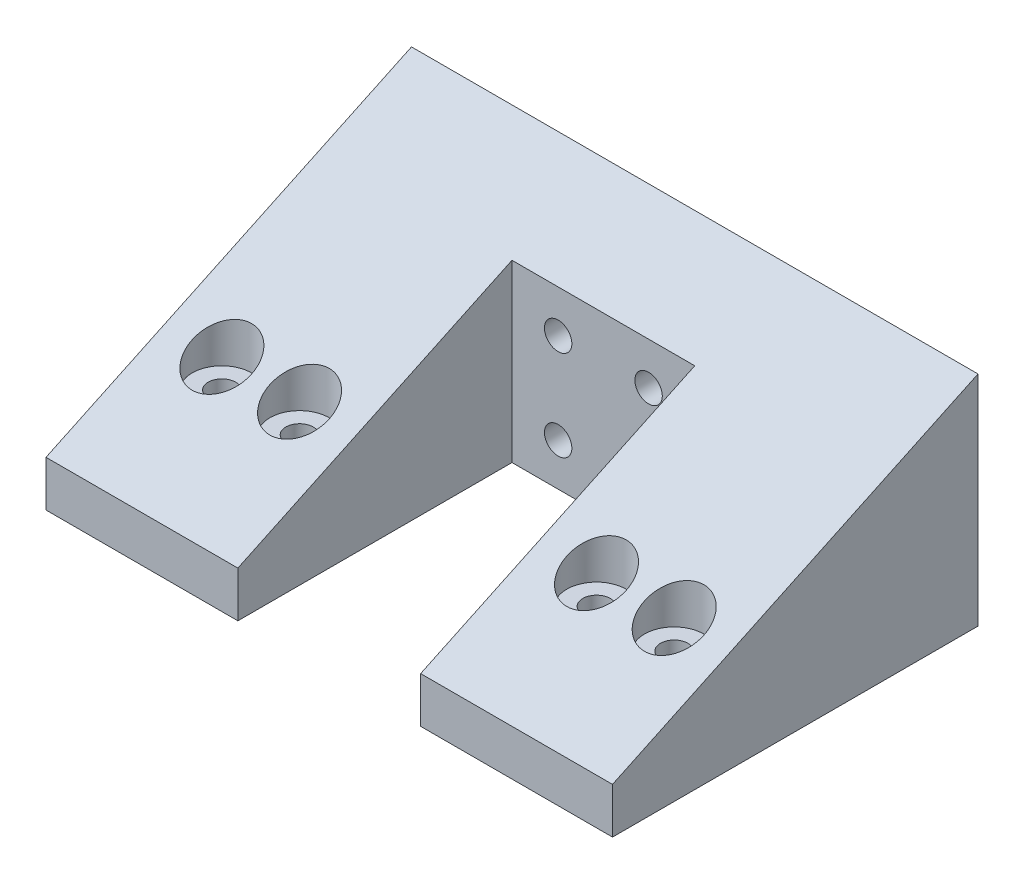
ISO-10303-21;
HEADER;
FILE_DESCRIPTION(('STEP AP214'),'2;1');
FILE_NAME('part.step','',(''),(''),'','','');
FILE_SCHEMA(('AUTOMOTIVE_DESIGN { 1 0 10303 214 1 1 1 1 }'));
ENDSEC;
DATA;
#1=APPLICATION_CONTEXT('core data for automotive mechanical design processes');
#2=APPLICATION_PROTOCOL_DEFINITION('international standard','automotive_design',2000,#1);
#3=PRODUCT_CONTEXT('',#1,'mechanical');
#4=PRODUCT('Part','Part','',(#3));
#5=PRODUCT_RELATED_PRODUCT_CATEGORY('part','',(#4));
#6=PRODUCT_DEFINITION_FORMATION('','',#4);
#7=PRODUCT_DEFINITION_CONTEXT('part definition',#1,'design');
#8=PRODUCT_DEFINITION('design','',#6,#7);
#9=PRODUCT_DEFINITION_SHAPE('','',#8);
#10=(LENGTH_UNIT() NAMED_UNIT(*) SI_UNIT(.MILLI.,.METRE.));
#11=(NAMED_UNIT(*) PLANE_ANGLE_UNIT() SI_UNIT($,.RADIAN.));
#12=(NAMED_UNIT(*) SI_UNIT($,.STERADIAN.) SOLID_ANGLE_UNIT());
#13=UNCERTAINTY_MEASURE_WITH_UNIT(LENGTH_MEASURE(1.E-05),#10,'distance_accuracy_value','');
#14=(GEOMETRIC_REPRESENTATION_CONTEXT(3) GLOBAL_UNCERTAINTY_ASSIGNED_CONTEXT((#13)) GLOBAL_UNIT_ASSIGNED_CONTEXT((#10,
#11,#12)) REPRESENTATION_CONTEXT('',''));
#15=CARTESIAN_POINT('',(0.,0.,0.));
#16=DIRECTION('',(0.,0.,1.));
#17=DIRECTION('',(1.,0.,0.));
#18=AXIS2_PLACEMENT_3D('',#15,#16,#17);
#19=CARTESIAN_POINT('',(0.,0.,40.));
#20=DIRECTION('',(0.,0.,-1.));
#21=DIRECTION('',(-1.,0.,0.));
#22=AXIS2_PLACEMENT_3D('',#19,#20,#21);
#23=PLANE('',#22);
#24=DIRECTION('',(0.,1.,0.));
#25=VECTOR('',#24,1.);
#26=CARTESIAN_POINT('',(31.,-11.95,40.));
#27=LINE('',#26,#25);
#28=CARTESIAN_POINT('',(31.,-11.95,40.));
#29=VERTEX_POINT('',#28);
#30=CARTESIAN_POINT('',(31.,-6.95,40.));
#31=VERTEX_POINT('',#30);
#32=EDGE_CURVE('E95',#29,#31,#27,.T.);
#33=ORIENTED_EDGE('',*,*,#32,.T.);
#34=DIRECTION('',(1.,0.,0.));
#35=VECTOR('',#34,1.);
#36=CARTESIAN_POINT('',(-31.,-6.95,40.));
#37=LINE('',#36,#35);
#38=CARTESIAN_POINT('',(9.99999999999999,-6.95,40.));
#39=VERTEX_POINT('',#38);
#40=EDGE_CURVE('E177',#39,#31,#37,.T.);
#41=ORIENTED_EDGE('',*,*,#40,.F.);
#42=DIRECTION('',(0.,1.,0.));
#43=VECTOR('',#42,1.);
#44=CARTESIAN_POINT('',(9.99999999999999,11.95,40.));
#45=LINE('',#44,#43);
#46=CARTESIAN_POINT('',(10.,-11.95,40.));
#47=VERTEX_POINT('',#46);
#48=EDGE_CURVE('E188',#47,#39,#45,.T.);
#49=ORIENTED_EDGE('',*,*,#48,.F.);
#50=DIRECTION('',(1.,0.,0.));
#51=VECTOR('',#50,1.);
#52=CARTESIAN_POINT('',(-31.,-11.95,40.));
#53=LINE('',#52,#51);
#54=EDGE_CURVE('E62',#47,#29,#53,.T.);
#55=ORIENTED_EDGE('',*,*,#54,.T.);
#56=EDGE_LOOP('',(#33,#41,#49,#55));
#57=FACE_BOUND('',#56,.T.);
#58=ADVANCED_FACE('F37',(#57),#23,.F.);
#59=CARTESIAN_POINT('',(-31.,-11.95,40.));
#60=DIRECTION('',(1.,0.,0.));
#61=DIRECTION('',(0.,0.,-1.));
#62=AXIS2_PLACEMENT_3D('',#59,#60,#61);
#63=PLANE('',#62);
#64=DIRECTION('',(0.,-1.,0.));
#65=VECTOR('',#64,1.);
#66=CARTESIAN_POINT('',(-31.,-11.95,40.));
#67=LINE('',#66,#65);
#68=CARTESIAN_POINT('',(-31.,-6.95,40.));
#69=VERTEX_POINT('',#68);
#70=CARTESIAN_POINT('',(-31.,-11.95,40.));
#71=VERTEX_POINT('',#70);
#72=EDGE_CURVE('E101',#69,#71,#67,.T.);
#73=ORIENTED_EDGE('',*,*,#72,.F.);
#74=DIRECTION('',(0.,0.427211653760932,-0.904151648171284));
#75=VECTOR('',#74,1.);
#76=CARTESIAN_POINT('',(-31.,11.95,0.));
#77=LINE('',#76,#75);
#78=CARTESIAN_POINT('',(-31.,11.95,0.));
#79=VERTEX_POINT('',#78);
#80=EDGE_CURVE('E174',#69,#79,#77,.T.);
#81=ORIENTED_EDGE('',*,*,#80,.T.);
#82=DIRECTION('',(0.,-1.,0.));
#83=VECTOR('',#82,1.);
#84=CARTESIAN_POINT('',(-31.,-11.95,0.));
#85=LINE('',#84,#83);
#86=CARTESIAN_POINT('',(-31.,-11.95,0.));
#87=VERTEX_POINT('',#86);
#88=EDGE_CURVE('E87',#79,#87,#85,.T.);
#89=ORIENTED_EDGE('',*,*,#88,.T.);
#90=DIRECTION('',(0.,0.,-1.));
#91=VECTOR('',#90,1.);
#92=CARTESIAN_POINT('',(-31.,-11.95,40.));
#93=LINE('',#92,#91);
#94=EDGE_CURVE('E46',#71,#87,#93,.T.);
#95=ORIENTED_EDGE('',*,*,#94,.F.);
#96=EDGE_LOOP('',(#73,#81,#89,#95));
#97=FACE_BOUND('',#96,.T.);
#98=ADVANCED_FACE('F39',(#97),#63,.F.);
#99=CARTESIAN_POINT('',(-31.,-11.95,40.));
#100=DIRECTION('',(0.,1.,0.));
#101=DIRECTION('',(0.,0.,1.));
#102=AXIS2_PLACEMENT_3D('',#99,#100,#101);
#103=PLANE('',#102);
#104=CARTESIAN_POINT('',(-24.75,-11.95,27.));
#105=DIRECTION('',(0.,1.,0.));
#106=DIRECTION('',(0.,0.,1.));
#107=AXIS2_PLACEMENT_3D('',#104,#105,#106);
#108=CIRCLE('',#107,1.5);
#109=CARTESIAN_POINT('',(-24.75,-11.95,28.5));
#110=VERTEX_POINT('',#109);
#111=EDGE_CURVE('E124',#110,#110,#108,.T.);
#112=ORIENTED_EDGE('',*,*,#111,.T.);
#113=EDGE_LOOP('',(#112));
#114=FACE_BOUND('',#113,.T.);
#115=CARTESIAN_POINT('',(-16.25,-11.95,26.9999999999999));
#116=DIRECTION('',(0.,1.,0.));
#117=DIRECTION('',(0.,0.,1.));
#118=AXIS2_PLACEMENT_3D('',#115,#116,#117);
#119=CIRCLE('',#118,1.5);
#120=CARTESIAN_POINT('',(-16.25,-11.95,28.4999999999999));
#121=VERTEX_POINT('',#120);
#122=EDGE_CURVE('E278',#121,#121,#119,.T.);
#123=ORIENTED_EDGE('',*,*,#122,.T.);
#124=EDGE_LOOP('',(#123));
#125=FACE_BOUND('',#124,.T.);
#126=CARTESIAN_POINT('',(16.25,-11.95,26.9999999999999));
#127=DIRECTION('',(0.,1.,0.));
#128=DIRECTION('',(0.,0.,-1.));
#129=AXIS2_PLACEMENT_3D('',#126,#127,#128);
#130=CIRCLE('',#129,1.5);
#131=CARTESIAN_POINT('',(16.25,-11.95,28.4999999999999));
#132=VERTEX_POINT('',#131);
#133=EDGE_CURVE('E282',#132,#132,#130,.T.);
#134=ORIENTED_EDGE('',*,*,#133,.T.);
#135=EDGE_LOOP('',(#134));
#136=FACE_BOUND('',#135,.T.);
#137=CARTESIAN_POINT('',(24.75,-11.95,27.));
#138=DIRECTION('',(0.,1.,0.));
#139=DIRECTION('',(0.,0.,-1.));
#140=AXIS2_PLACEMENT_3D('',#137,#138,#139);
#141=CIRCLE('',#140,1.50000000000001);
#142=CARTESIAN_POINT('',(24.75,-11.95,28.5));
#143=VERTEX_POINT('',#142);
#144=EDGE_CURVE('E144',#143,#143,#141,.T.);
#145=ORIENTED_EDGE('',*,*,#144,.T.);
#146=EDGE_LOOP('',(#145));
#147=FACE_BOUND('',#146,.T.);
#148=ORIENTED_EDGE('',*,*,#54,.F.);
#149=DIRECTION('',(0.,0.,1.));
#150=VECTOR('',#149,1.);
#151=CARTESIAN_POINT('',(10.,-11.95,-31.1642423299525));
#152=LINE('',#151,#150);
#153=CARTESIAN_POINT('',(10.,-11.95,10.));
#154=VERTEX_POINT('',#153);
#155=EDGE_CURVE('E196',#154,#47,#152,.T.);
#156=ORIENTED_EDGE('',*,*,#155,.F.);
#157=DIRECTION('',(1.,0.,0.));
#158=VECTOR('',#157,1.);
#159=CARTESIAN_POINT('',(-10.,-11.95,10.));
#160=LINE('',#159,#158);
#161=CARTESIAN_POINT('',(-10.,-11.95,10.));
#162=VERTEX_POINT('',#161);
#163=EDGE_CURVE('E191',#162,#154,#160,.T.);
#164=ORIENTED_EDGE('',*,*,#163,.F.);
#165=DIRECTION('',(0.,0.,1.));
#166=VECTOR('',#165,1.);
#167=CARTESIAN_POINT('',(-10.,-11.95,-31.1642423299525));
#168=LINE('',#167,#166);
#169=CARTESIAN_POINT('',(-10.,-11.95,40.));
#170=VERTEX_POINT('',#169);
#171=EDGE_CURVE('E200',#162,#170,#168,.T.);
#172=ORIENTED_EDGE('',*,*,#171,.T.);
#173=EDGE_CURVE('E209',#71,#170,#53,.T.);
#174=ORIENTED_EDGE('',*,*,#173,.F.);
#175=ORIENTED_EDGE('',*,*,#94,.T.);
#176=DIRECTION('',(1.,0.,0.));
#177=VECTOR('',#176,1.);
#178=CARTESIAN_POINT('',(-31.,-11.95,0.));
#179=LINE('',#178,#177);
#180=CARTESIAN_POINT('',(31.,-11.95,0.));
#181=VERTEX_POINT('',#180);
#182=EDGE_CURVE('E75',#87,#181,#179,.T.);
#183=ORIENTED_EDGE('',*,*,#182,.T.);
#184=DIRECTION('',(0.,0.,-1.));
#185=VECTOR('',#184,1.);
#186=CARTESIAN_POINT('',(31.,-11.95,40.));
#187=LINE('',#186,#185);
#188=EDGE_CURVE('E78',#29,#181,#187,.T.);
#189=ORIENTED_EDGE('',*,*,#188,.F.);
#190=EDGE_LOOP('',(#148,#156,#164,#172,#174,#175,#183,#189));
#191=FACE_BOUND('',#190,.T.);
#192=ADVANCED_FACE('F77',(#114,#125,#136,#147,#191),#103,.F.);
#193=CARTESIAN_POINT('',(31.,-11.95,40.));
#194=DIRECTION('',(-1.,0.,0.));
#195=DIRECTION('',(0.,0.,1.));
#196=AXIS2_PLACEMENT_3D('',#193,#194,#195);
#197=PLANE('',#196);
#198=DIRECTION('',(0.,1.,0.));
#199=VECTOR('',#198,1.);
#200=CARTESIAN_POINT('',(31.,-11.95,0.));
#201=LINE('',#200,#199);
#202=CARTESIAN_POINT('',(31.,11.95,0.));
#203=VERTEX_POINT('',#202);
#204=EDGE_CURVE('E86',#181,#203,#201,.T.);
#205=ORIENTED_EDGE('',*,*,#204,.T.);
#206=DIRECTION('',(0.,0.427211653760932,-0.904151648171284));
#207=VECTOR('',#206,1.);
#208=CARTESIAN_POINT('',(31.,11.95,0.));
#209=LINE('',#208,#207);
#210=EDGE_CURVE('E171',#31,#203,#209,.T.);
#211=ORIENTED_EDGE('',*,*,#210,.F.);
#212=ORIENTED_EDGE('',*,*,#32,.F.);
#213=ORIENTED_EDGE('',*,*,#188,.T.);
#214=EDGE_LOOP('',(#205,#211,#212,#213));
#215=FACE_BOUND('',#214,.T.);
#216=ADVANCED_FACE('F91',(#215),#197,.F.);
#217=DIRECTION('',(0.,-1.,0.));
#218=VECTOR('',#217,1.);
#219=CARTESIAN_POINT('',(-10.,11.95,40.));
#220=LINE('',#219,#218);
#221=CARTESIAN_POINT('',(-10.,-6.94999999999999,40.));
#222=VERTEX_POINT('',#221);
#223=EDGE_CURVE('E187',#222,#170,#220,.T.);
#224=ORIENTED_EDGE('',*,*,#223,.F.);
#225=EDGE_CURVE('E54',#69,#222,#37,.T.);
#226=ORIENTED_EDGE('',*,*,#225,.F.);
#227=ORIENTED_EDGE('',*,*,#72,.T.);
#228=ORIENTED_EDGE('',*,*,#173,.T.);
#229=EDGE_LOOP('',(#224,#226,#227,#228));
#230=FACE_BOUND('',#229,.T.);
#231=ADVANCED_FACE('F251',(#230),#23,.F.);
#232=CARTESIAN_POINT('',(0.,0.,0.));
#233=DIRECTION('',(0.,0.,-1.));
#234=DIRECTION('',(-1.,0.,0.));
#235=AXIS2_PLACEMENT_3D('',#232,#233,#234);
#236=PLANE('',#235);
#237=CARTESIAN_POINT('',(-4.95,-7.3125,0.));
#238=DIRECTION('',(0.,0.,1.));
#239=DIRECTION('',(1.,0.,0.));
#240=AXIS2_PLACEMENT_3D('',#237,#238,#239);
#241=CIRCLE('',#240,1.5);
#242=CARTESIAN_POINT('',(-3.45,-7.3125,0.));
#243=VERTEX_POINT('',#242);
#244=EDGE_CURVE('E163',#243,#243,#241,.T.);
#245=ORIENTED_EDGE('',*,*,#244,.T.);
#246=EDGE_LOOP('',(#245));
#247=FACE_BOUND('',#246,.T.);
#248=CARTESIAN_POINT('',(4.95,-7.3125,0.));
#249=DIRECTION('',(0.,0.,1.));
#250=DIRECTION('',(1.,0.,0.));
#251=AXIS2_PLACEMENT_3D('',#248,#249,#250);
#252=CIRCLE('',#251,1.5);
#253=CARTESIAN_POINT('',(6.45,-7.3125,0.));
#254=VERTEX_POINT('',#253);
#255=EDGE_CURVE('E157',#254,#254,#252,.T.);
#256=ORIENTED_EDGE('',*,*,#255,.T.);
#257=EDGE_LOOP('',(#256));
#258=FACE_BOUND('',#257,.T.);
#259=CARTESIAN_POINT('',(4.95,2.5875,0.));
#260=DIRECTION('',(0.,0.,1.));
#261=DIRECTION('',(1.,0.,0.));
#262=AXIS2_PLACEMENT_3D('',#259,#260,#261);
#263=CIRCLE('',#262,1.5);
#264=CARTESIAN_POINT('',(6.45,2.5875,0.));
#265=VERTEX_POINT('',#264);
#266=EDGE_CURVE('E150',#265,#265,#263,.T.);
#267=ORIENTED_EDGE('',*,*,#266,.T.);
#268=EDGE_LOOP('',(#267));
#269=FACE_BOUND('',#268,.T.);
#270=CARTESIAN_POINT('',(-4.95,2.5875,0.));
#271=DIRECTION('',(0.,0.,1.));
#272=DIRECTION('',(1.,0.,0.));
#273=AXIS2_PLACEMENT_3D('',#270,#271,#272);
#274=CIRCLE('',#273,1.5);
#275=CARTESIAN_POINT('',(-3.45,2.5875,0.));
#276=VERTEX_POINT('',#275);
#277=EDGE_CURVE('E168',#276,#276,#274,.T.);
#278=ORIENTED_EDGE('',*,*,#277,.T.);
#279=EDGE_LOOP('',(#278));
#280=FACE_BOUND('',#279,.T.);
#281=ORIENTED_EDGE('',*,*,#88,.F.);
#282=DIRECTION('',(-1.,0.,0.));
#283=VECTOR('',#282,1.);
#284=CARTESIAN_POINT('',(-31.,11.95,0.));
#285=LINE('',#284,#283);
#286=EDGE_CURVE('E99',#203,#79,#285,.T.);
#287=ORIENTED_EDGE('',*,*,#286,.F.);
#288=ORIENTED_EDGE('',*,*,#204,.F.);
#289=ORIENTED_EDGE('',*,*,#182,.F.);
#290=EDGE_LOOP('',(#281,#287,#288,#289));
#291=FACE_BOUND('',#290,.T.);
#292=ADVANCED_FACE('F97',(#247,#258,#269,#280,#291),#236,.T.);
#293=CARTESIAN_POINT('',(0.,0.,10.));
#294=DIRECTION('',(0.,0.,-1.));
#295=DIRECTION('',(-1.,0.,0.));
#296=AXIS2_PLACEMENT_3D('',#293,#294,#295);
#297=PLANE('',#296);
#298=CARTESIAN_POINT('',(-4.95,-7.3125,10.));
#299=DIRECTION('',(0.,0.,1.));
#300=DIRECTION('',(1.,0.,0.));
#301=AXIS2_PLACEMENT_3D('',#298,#299,#300);
#302=CIRCLE('',#301,1.5);
#303=CARTESIAN_POINT('',(-3.45,-7.3125,10.));
#304=VERTEX_POINT('',#303);
#305=EDGE_CURVE('E119',#304,#304,#302,.T.);
#306=ORIENTED_EDGE('',*,*,#305,.F.);
#307=EDGE_LOOP('',(#306));
#308=FACE_BOUND('',#307,.T.);
#309=CARTESIAN_POINT('',(4.95,-7.3125,10.));
#310=DIRECTION('',(0.,0.,1.));
#311=DIRECTION('',(1.,0.,0.));
#312=AXIS2_PLACEMENT_3D('',#309,#310,#311);
#313=CIRCLE('',#312,1.5);
#314=CARTESIAN_POINT('',(6.45,-7.3125,10.));
#315=VERTEX_POINT('',#314);
#316=EDGE_CURVE('E160',#315,#315,#313,.T.);
#317=ORIENTED_EDGE('',*,*,#316,.F.);
#318=EDGE_LOOP('',(#317));
#319=FACE_BOUND('',#318,.T.);
#320=CARTESIAN_POINT('',(4.95,2.5875,10.));
#321=DIRECTION('',(0.,0.,1.));
#322=DIRECTION('',(1.,0.,0.));
#323=AXIS2_PLACEMENT_3D('',#320,#321,#322);
#324=CIRCLE('',#323,1.5);
#325=CARTESIAN_POINT('',(6.45,2.5875,10.));
#326=VERTEX_POINT('',#325);
#327=EDGE_CURVE('E154',#326,#326,#324,.T.);
#328=ORIENTED_EDGE('',*,*,#327,.F.);
#329=EDGE_LOOP('',(#328));
#330=FACE_BOUND('',#329,.T.);
#331=CARTESIAN_POINT('',(-4.95,2.5875,10.));
#332=DIRECTION('',(0.,0.,1.));
#333=DIRECTION('',(1.,0.,0.));
#334=AXIS2_PLACEMENT_3D('',#331,#332,#333);
#335=CIRCLE('',#334,1.5);
#336=CARTESIAN_POINT('',(-3.45,2.5875,10.));
#337=VERTEX_POINT('',#336);
#338=EDGE_CURVE('E153',#337,#337,#335,.T.);
#339=ORIENTED_EDGE('',*,*,#338,.F.);
#340=EDGE_LOOP('',(#339));
#341=FACE_BOUND('',#340,.T.);
#342=DIRECTION('',(0.,1.,0.));
#343=VECTOR('',#342,1.);
#344=CARTESIAN_POINT('',(9.99999999999999,11.95,10.));
#345=LINE('',#344,#343);
#346=CARTESIAN_POINT('',(10.,7.225,10.));
#347=VERTEX_POINT('',#346);
#348=EDGE_CURVE('E201',#154,#347,#345,.T.);
#349=ORIENTED_EDGE('',*,*,#348,.T.);
#350=DIRECTION('',(-1.,0.,0.));
#351=VECTOR('',#350,1.);
#352=CARTESIAN_POINT('',(0.,7.225,10.));
#353=LINE('',#352,#351);
#354=CARTESIAN_POINT('',(-10.,7.225,10.));
#355=VERTEX_POINT('',#354);
#356=EDGE_CURVE('E181',#347,#355,#353,.T.);
#357=ORIENTED_EDGE('',*,*,#356,.T.);
#358=DIRECTION('',(0.,-1.,0.));
#359=VECTOR('',#358,1.);
#360=CARTESIAN_POINT('',(-10.,11.95,10.));
#361=LINE('',#360,#359);
#362=EDGE_CURVE('E197',#355,#162,#361,.T.);
#363=ORIENTED_EDGE('',*,*,#362,.T.);
#364=ORIENTED_EDGE('',*,*,#163,.T.);
#365=EDGE_LOOP('',(#349,#357,#363,#364));
#366=FACE_BOUND('',#365,.T.);
#367=ADVANCED_FACE('F240',(#308,#319,#330,#341,#366),#297,.F.);
#368=CARTESIAN_POINT('',(9.99999999999999,11.95,-31.1642423299525));
#369=DIRECTION('',(1.,0.,0.));
#370=DIRECTION('',(0.,1.,0.));
#371=AXIS2_PLACEMENT_3D('',#368,#369,#370);
#372=PLANE('',#371);
#373=ORIENTED_EDGE('',*,*,#48,.T.);
#374=DIRECTION('',(0.,0.427211653760932,-0.904151648171284));
#375=VECTOR('',#374,1.);
#376=CARTESIAN_POINT('',(9.99999999999999,23.9876286660318,-25.4764627852524));
#377=LINE('',#376,#375);
#378=EDGE_CURVE('E184',#39,#347,#377,.T.);
#379=ORIENTED_EDGE('',*,*,#378,.T.);
#380=ORIENTED_EDGE('',*,*,#348,.F.);
#381=ORIENTED_EDGE('',*,*,#155,.T.);
#382=EDGE_LOOP('',(#373,#379,#380,#381));
#383=FACE_BOUND('',#382,.T.);
#384=ADVANCED_FACE('F247',(#383),#372,.F.);
#385=CARTESIAN_POINT('',(-10.,11.95,-31.1642423299525));
#386=DIRECTION('',(-1.,0.,0.));
#387=DIRECTION('',(0.,-1.,0.));
#388=AXIS2_PLACEMENT_3D('',#385,#386,#387);
#389=PLANE('',#388);
#390=ORIENTED_EDGE('',*,*,#362,.F.);
#391=DIRECTION('',(0.,-0.427211653760932,0.904151648171284));
#392=VECTOR('',#391,1.);
#393=CARTESIAN_POINT('',(-10.,23.9876286660318,-25.4764627852524));
#394=LINE('',#393,#392);
#395=EDGE_CURVE('E12',#355,#222,#394,.T.);
#396=ORIENTED_EDGE('',*,*,#395,.T.);
#397=ORIENTED_EDGE('',*,*,#223,.T.);
#398=ORIENTED_EDGE('',*,*,#171,.F.);
#399=EDGE_LOOP('',(#390,#396,#397,#398));
#400=FACE_BOUND('',#399,.T.);
#401=ADVANCED_FACE('F244',(#400),#389,.F.);
#402=CARTESIAN_POINT('',(-31.,11.95,0.));
#403=DIRECTION('',(0.,-0.904151648171284,-0.427211653760932));
#404=DIRECTION('',(0.,0.427211653760932,-0.904151648171284));
#405=AXIS2_PLACEMENT_3D('',#402,#403,#404);
#406=PLANE('',#405);
#407=CARTESIAN_POINT('',(-24.75,-0.807499999999999,27.));
#408=DIRECTION('',(0.,-0.904151648171284,-0.427211653760932));
#409=DIRECTION('',(0.,0.427211653760932,-0.904151648171284));
#410=AXIS2_PLACEMENT_3D('',#407,#408,#409);
#411=ELLIPSE('',#410,3.5945297523633,3.25);
#412=CARTESIAN_POINT('',(-24.75,0.728125,23.75));
#413=VERTEX_POINT('',#412);
#414=EDGE_CURVE('E116',#413,#413,#411,.T.);
#415=ORIENTED_EDGE('',*,*,#414,.T.);
#416=EDGE_LOOP('',(#415));
#417=FACE_BOUND('',#416,.T.);
#418=CARTESIAN_POINT('',(24.75,-0.807499999999999,27.));
#419=DIRECTION('',(0.,-0.904151648171284,-0.427211653760932));
#420=DIRECTION('',(0.,0.427211653760932,-0.904151648171284));
#421=AXIS2_PLACEMENT_3D('',#418,#419,#420);
#422=ELLIPSE('',#421,3.5945297523633,3.25);
#423=CARTESIAN_POINT('',(24.75,0.728125,23.75));
#424=VERTEX_POINT('',#423);
#425=EDGE_CURVE('E113',#424,#424,#422,.T.);
#426=ORIENTED_EDGE('',*,*,#425,.T.);
#427=EDGE_LOOP('',(#426));
#428=FACE_BOUND('',#427,.T.);
#429=CARTESIAN_POINT('',(16.25,-0.807499999999971,26.9999999999999));
#430=DIRECTION('',(0.,-0.904151648171284,-0.427211653760932));
#431=DIRECTION('',(0.,0.427211653760932,-0.904151648171284));
#432=AXIS2_PLACEMENT_3D('',#429,#430,#431);
#433=ELLIPSE('',#432,3.5945297523633,3.25);
#434=CARTESIAN_POINT('',(16.25,0.728125000000026,23.7499999999999));
#435=VERTEX_POINT('',#434);
#436=EDGE_CURVE('E109',#435,#435,#433,.T.);
#437=ORIENTED_EDGE('',*,*,#436,.T.);
#438=EDGE_LOOP('',(#437));
#439=FACE_BOUND('',#438,.T.);
#440=CARTESIAN_POINT('',(-16.25,-0.807499999999971,26.9999999999999));
#441=DIRECTION('',(0.,-0.904151648171284,-0.427211653760932));
#442=DIRECTION('',(0.,0.427211653760932,-0.904151648171284));
#443=AXIS2_PLACEMENT_3D('',#440,#441,#442);
#444=ELLIPSE('',#443,3.5945297523633,3.25);
#445=CARTESIAN_POINT('',(-16.25,0.728125000000028,23.7499999999999));
#446=VERTEX_POINT('',#445);
#447=EDGE_CURVE('E106',#446,#446,#444,.T.);
#448=ORIENTED_EDGE('',*,*,#447,.T.);
#449=EDGE_LOOP('',(#448));
#450=FACE_BOUND('',#449,.T.);
#451=ORIENTED_EDGE('',*,*,#40,.T.);
#452=ORIENTED_EDGE('',*,*,#210,.T.);
#453=ORIENTED_EDGE('',*,*,#286,.T.);
#454=ORIENTED_EDGE('',*,*,#80,.F.);
#455=ORIENTED_EDGE('',*,*,#225,.T.);
#456=ORIENTED_EDGE('',*,*,#395,.F.);
#457=ORIENTED_EDGE('',*,*,#356,.F.);
#458=ORIENTED_EDGE('',*,*,#378,.F.);
#459=EDGE_LOOP('',(#451,#452,#453,#454,#455,#456,#457,#458));
#460=FACE_BOUND('',#459,.T.);
#461=ADVANCED_FACE('F249',(#417,#428,#439,#450,#460),#406,.F.);
#462=CARTESIAN_POINT('',(-4.95,2.5875,0.));
#463=DIRECTION('',(0.,0.,1.));
#464=DIRECTION('',(1.,0.,0.));
#465=AXIS2_PLACEMENT_3D('',#462,#463,#464);
#466=CYLINDRICAL_SURFACE('',#465,1.5);
#467=ORIENTED_EDGE('',*,*,#277,.F.);
#468=EDGE_LOOP('',(#467));
#469=FACE_BOUND('',#468,.T.);
#470=ORIENTED_EDGE('',*,*,#338,.T.);
#471=EDGE_LOOP('',(#470));
#472=FACE_BOUND('',#471,.T.);
#473=ADVANCED_FACE('F340',(#469,#472),#466,.F.);
#474=CARTESIAN_POINT('',(4.95,2.5875,0.));
#475=DIRECTION('',(0.,0.,1.));
#476=DIRECTION('',(1.,0.,0.));
#477=AXIS2_PLACEMENT_3D('',#474,#475,#476);
#478=CYLINDRICAL_SURFACE('',#477,1.5);
#479=ORIENTED_EDGE('',*,*,#266,.F.);
#480=EDGE_LOOP('',(#479));
#481=FACE_BOUND('',#480,.T.);
#482=ORIENTED_EDGE('',*,*,#327,.T.);
#483=EDGE_LOOP('',(#482));
#484=FACE_BOUND('',#483,.T.);
#485=ADVANCED_FACE('F336',(#481,#484),#478,.F.);
#486=CARTESIAN_POINT('',(4.95,-7.3125,0.));
#487=DIRECTION('',(0.,0.,1.));
#488=DIRECTION('',(1.,0.,0.));
#489=AXIS2_PLACEMENT_3D('',#486,#487,#488);
#490=CYLINDRICAL_SURFACE('',#489,1.5);
#491=ORIENTED_EDGE('',*,*,#255,.F.);
#492=EDGE_LOOP('',(#491));
#493=FACE_BOUND('',#492,.T.);
#494=ORIENTED_EDGE('',*,*,#316,.T.);
#495=EDGE_LOOP('',(#494));
#496=FACE_BOUND('',#495,.T.);
#497=ADVANCED_FACE('F339',(#493,#496),#490,.F.);
#498=CARTESIAN_POINT('',(-4.95,-7.3125,0.));
#499=DIRECTION('',(0.,0.,1.));
#500=DIRECTION('',(1.,0.,0.));
#501=AXIS2_PLACEMENT_3D('',#498,#499,#500);
#502=CYLINDRICAL_SURFACE('',#501,1.5);
#503=ORIENTED_EDGE('',*,*,#244,.F.);
#504=EDGE_LOOP('',(#503));
#505=FACE_BOUND('',#504,.T.);
#506=ORIENTED_EDGE('',*,*,#305,.T.);
#507=EDGE_LOOP('',(#506));
#508=FACE_BOUND('',#507,.T.);
#509=ADVANCED_FACE('F334',(#505,#508),#502,.F.);
#510=CARTESIAN_POINT('',(-16.25,-21.1423881554251,26.9999999999999));
#511=DIRECTION('',(0.,1.,0.));
#512=DIRECTION('',(0.,0.,1.));
#513=AXIS2_PLACEMENT_3D('',#510,#511,#512);
#514=CYLINDRICAL_SURFACE('',#513,3.25);
#515=CARTESIAN_POINT('',(-16.25,-3.95,26.9999999999999));
#516=DIRECTION('',(0.,1.,0.));
#517=DIRECTION('',(0.,0.,1.));
#518=AXIS2_PLACEMENT_3D('',#515,#516,#517);
#519=CIRCLE('',#518,3.25);
#520=CARTESIAN_POINT('',(-16.25,-3.95,30.2499999999999));
#521=VERTEX_POINT('',#520);
#522=EDGE_CURVE('E110',#521,#521,#519,.F.);
#523=ORIENTED_EDGE('',*,*,#522,.T.);
#524=EDGE_LOOP('',(#523));
#525=FACE_BOUND('',#524,.T.);
#526=ORIENTED_EDGE('',*,*,#447,.F.);
#527=EDGE_LOOP('',(#526));
#528=FACE_BOUND('',#527,.T.);
#529=ADVANCED_FACE('F330',(#525,#528),#514,.F.);
#530=CARTESIAN_POINT('',(-31.,-3.95,40.));
#531=DIRECTION('',(0.,1.,0.));
#532=DIRECTION('',(0.,0.,1.));
#533=AXIS2_PLACEMENT_3D('',#530,#531,#532);
#534=PLANE('',#533);
#535=CARTESIAN_POINT('',(-16.25,-3.95,26.9999999999999));
#536=DIRECTION('',(0.,1.,0.));
#537=DIRECTION('',(0.,0.,1.));
#538=AXIS2_PLACEMENT_3D('',#535,#536,#537);
#539=CIRCLE('',#538,1.5);
#540=CARTESIAN_POINT('',(-16.25,-3.95,28.4999999999999));
#541=VERTEX_POINT('',#540);
#542=EDGE_CURVE('E41',#541,#541,#539,.T.);
#543=ORIENTED_EDGE('',*,*,#542,.F.);
#544=EDGE_LOOP('',(#543));
#545=FACE_BOUND('',#544,.T.);
#546=ORIENTED_EDGE('',*,*,#522,.F.);
#547=EDGE_LOOP('',(#546));
#548=FACE_BOUND('',#547,.T.);
#549=ADVANCED_FACE('F313',(#545,#548),#534,.T.);
#550=CARTESIAN_POINT('',(16.25,-21.1423881554251,26.9999999999999));
#551=DIRECTION('',(0.,1.,0.));
#552=DIRECTION('',(0.,0.,1.));
#553=AXIS2_PLACEMENT_3D('',#550,#551,#552);
#554=CYLINDRICAL_SURFACE('',#553,3.25);
#555=CARTESIAN_POINT('',(16.25,-3.95,26.9999999999999));
#556=DIRECTION('',(0.,1.,0.));
#557=DIRECTION('',(0.,0.,1.));
#558=AXIS2_PLACEMENT_3D('',#555,#556,#557);
#559=CIRCLE('',#558,3.25);
#560=CARTESIAN_POINT('',(16.25,-3.95,30.2499999999999));
#561=VERTEX_POINT('',#560);
#562=EDGE_CURVE('E131',#561,#561,#559,.F.);
#563=ORIENTED_EDGE('',*,*,#562,.T.);
#564=EDGE_LOOP('',(#563));
#565=FACE_BOUND('',#564,.T.);
#566=ORIENTED_EDGE('',*,*,#436,.F.);
#567=EDGE_LOOP('',(#566));
#568=FACE_BOUND('',#567,.T.);
#569=ADVANCED_FACE('F309',(#565,#568),#554,.F.);
#570=CARTESIAN_POINT('',(-31.,-3.95,40.));
#571=DIRECTION('',(0.,1.,0.));
#572=DIRECTION('',(0.,0.,1.));
#573=AXIS2_PLACEMENT_3D('',#570,#571,#572);
#574=PLANE('',#573);
#575=CARTESIAN_POINT('',(16.25,-3.95,26.9999999999999));
#576=DIRECTION('',(0.,1.,0.));
#577=DIRECTION('',(0.,0.,1.));
#578=AXIS2_PLACEMENT_3D('',#575,#576,#577);
#579=CIRCLE('',#578,1.5);
#580=CARTESIAN_POINT('',(16.25,-3.95,28.4999999999999));
#581=VERTEX_POINT('',#580);
#582=EDGE_CURVE('E126',#581,#581,#579,.T.);
#583=ORIENTED_EDGE('',*,*,#582,.F.);
#584=EDGE_LOOP('',(#583));
#585=FACE_BOUND('',#584,.T.);
#586=ORIENTED_EDGE('',*,*,#562,.F.);
#587=EDGE_LOOP('',(#586));
#588=FACE_BOUND('',#587,.T.);
#589=ADVANCED_FACE('F305',(#585,#588),#574,.T.);
#590=CARTESIAN_POINT('',(24.75,-21.1423881554251,27.));
#591=DIRECTION('',(0.,1.,0.));
#592=DIRECTION('',(0.,0.,1.));
#593=AXIS2_PLACEMENT_3D('',#590,#591,#592);
#594=CYLINDRICAL_SURFACE('',#593,3.25);
#595=CARTESIAN_POINT('',(24.75,-3.95,27.));
#596=DIRECTION('',(0.,1.,0.));
#597=DIRECTION('',(0.,0.,1.));
#598=AXIS2_PLACEMENT_3D('',#595,#596,#597);
#599=CIRCLE('',#598,3.25);
#600=CARTESIAN_POINT('',(24.75,-3.95,30.25));
#601=VERTEX_POINT('',#600);
#602=EDGE_CURVE('E135',#601,#601,#599,.F.);
#603=ORIENTED_EDGE('',*,*,#602,.T.);
#604=EDGE_LOOP('',(#603));
#605=FACE_BOUND('',#604,.T.);
#606=ORIENTED_EDGE('',*,*,#425,.F.);
#607=EDGE_LOOP('',(#606));
#608=FACE_BOUND('',#607,.T.);
#609=ADVANCED_FACE('F308',(#605,#608),#594,.F.);
#610=CARTESIAN_POINT('',(-31.,-3.95,40.));
#611=DIRECTION('',(0.,1.,0.));
#612=DIRECTION('',(0.,0.,1.));
#613=AXIS2_PLACEMENT_3D('',#610,#611,#612);
#614=PLANE('',#613);
#615=CARTESIAN_POINT('',(24.75,-3.95,27.));
#616=DIRECTION('',(0.,1.,0.));
#617=DIRECTION('',(0.,0.,1.));
#618=AXIS2_PLACEMENT_3D('',#615,#616,#617);
#619=CIRCLE('',#618,1.50000000000001);
#620=CARTESIAN_POINT('',(24.75,-3.95,28.5));
#621=VERTEX_POINT('',#620);
#622=EDGE_CURVE('E123',#621,#621,#619,.T.);
#623=ORIENTED_EDGE('',*,*,#622,.F.);
#624=EDGE_LOOP('',(#623));
#625=FACE_BOUND('',#624,.T.);
#626=ORIENTED_EDGE('',*,*,#602,.F.);
#627=EDGE_LOOP('',(#626));
#628=FACE_BOUND('',#627,.T.);
#629=ADVANCED_FACE('F320',(#625,#628),#614,.T.);
#630=CARTESIAN_POINT('',(-24.75,-21.1423881554251,27.));
#631=DIRECTION('',(0.,1.,0.));
#632=DIRECTION('',(0.,0.,1.));
#633=AXIS2_PLACEMENT_3D('',#630,#631,#632);
#634=CYLINDRICAL_SURFACE('',#633,3.25);
#635=CARTESIAN_POINT('',(-24.75,-3.95,27.));
#636=DIRECTION('',(0.,1.,0.));
#637=DIRECTION('',(0.,0.,1.));
#638=AXIS2_PLACEMENT_3D('',#635,#636,#637);
#639=CIRCLE('',#638,3.25);
#640=CARTESIAN_POINT('',(-24.75,-3.95,30.25));
#641=VERTEX_POINT('',#640);
#642=EDGE_CURVE('E140',#641,#641,#639,.F.);
#643=ORIENTED_EDGE('',*,*,#642,.T.);
#644=EDGE_LOOP('',(#643));
#645=FACE_BOUND('',#644,.T.);
#646=ORIENTED_EDGE('',*,*,#414,.F.);
#647=EDGE_LOOP('',(#646));
#648=FACE_BOUND('',#647,.T.);
#649=ADVANCED_FACE('F316',(#645,#648),#634,.F.);
#650=CARTESIAN_POINT('',(-31.,-3.95,40.));
#651=DIRECTION('',(0.,1.,0.));
#652=DIRECTION('',(0.,0.,1.));
#653=AXIS2_PLACEMENT_3D('',#650,#651,#652);
#654=PLANE('',#653);
#655=CARTESIAN_POINT('',(-24.75,-3.95,27.));
#656=DIRECTION('',(0.,1.,0.));
#657=DIRECTION('',(0.,0.,1.));
#658=AXIS2_PLACEMENT_3D('',#655,#656,#657);
#659=CIRCLE('',#658,1.5);
#660=CARTESIAN_POINT('',(-24.75,-3.95,28.5));
#661=VERTEX_POINT('',#660);
#662=EDGE_CURVE('E120',#661,#661,#659,.T.);
#663=ORIENTED_EDGE('',*,*,#662,.F.);
#664=EDGE_LOOP('',(#663));
#665=FACE_BOUND('',#664,.T.);
#666=ORIENTED_EDGE('',*,*,#642,.F.);
#667=EDGE_LOOP('',(#666));
#668=FACE_BOUND('',#667,.T.);
#669=ADVANCED_FACE('F300',(#665,#668),#654,.T.);
#670=CARTESIAN_POINT('',(-24.75,-11.95,27.));
#671=DIRECTION('',(0.,1.,0.));
#672=DIRECTION('',(0.,0.,1.));
#673=AXIS2_PLACEMENT_3D('',#670,#671,#672);
#674=CYLINDRICAL_SURFACE('',#673,1.5);
#675=CARTESIAN_POINT('',(-24.75,-3.95,28.5));
#676=CARTESIAN_POINT('',(-24.75,-4.03333333333333,28.5));
#677=CARTESIAN_POINT('',(-24.75,-4.11666666666666,28.5));
#678=CARTESIAN_POINT('',(-24.75,-4.28333333333333,28.5));
#679=CARTESIAN_POINT('',(-24.75,-4.36666666666666,28.5));
#680=CARTESIAN_POINT('',(-24.75,-4.53333333333333,28.5));
#681=CARTESIAN_POINT('',(-24.75,-4.61666666666666,28.5));
#682=CARTESIAN_POINT('',(-24.75,-4.78333333333333,28.5));
#683=CARTESIAN_POINT('',(-24.75,-4.86666666666666,28.5));
#684=CARTESIAN_POINT('',(-24.75,-5.03333333333333,28.5));
#685=CARTESIAN_POINT('',(-24.75,-5.11666666666666,28.5));
#686=CARTESIAN_POINT('',(-24.75,-5.28333333333333,28.5));
#687=CARTESIAN_POINT('',(-24.75,-5.36666666666666,28.5));
#688=CARTESIAN_POINT('',(-24.75,-5.53333333333333,28.5));
#689=CARTESIAN_POINT('',(-24.75,-5.61666666666666,28.5));
#690=CARTESIAN_POINT('',(-24.75,-5.78333333333333,28.5));
#691=CARTESIAN_POINT('',(-24.75,-5.86666666666666,28.5));
#692=CARTESIAN_POINT('',(-24.75,-6.03333333333333,28.5));
#693=CARTESIAN_POINT('',(-24.75,-6.11666666666666,28.5));
#694=CARTESIAN_POINT('',(-24.75,-6.28333333333333,28.5));
#695=CARTESIAN_POINT('',(-24.75,-6.36666666666666,28.5));
#696=CARTESIAN_POINT('',(-24.75,-6.53333333333333,28.5));
#697=CARTESIAN_POINT('',(-24.75,-6.61666666666666,28.5));
#698=CARTESIAN_POINT('',(-24.75,-6.78333333333333,28.5));
#699=CARTESIAN_POINT('',(-24.75,-6.86666666666667,28.5));
#700=CARTESIAN_POINT('',(-24.75,-7.03333333333333,28.5));
#701=CARTESIAN_POINT('',(-24.75,-7.11666666666667,28.5));
#702=CARTESIAN_POINT('',(-24.75,-7.28333333333333,28.5));
#703=CARTESIAN_POINT('',(-24.75,-7.36666666666667,28.5));
#704=CARTESIAN_POINT('',(-24.75,-7.53333333333333,28.5));
#705=CARTESIAN_POINT('',(-24.75,-7.61666666666667,28.5));
#706=CARTESIAN_POINT('',(-24.75,-7.78333333333333,28.5));
#707=CARTESIAN_POINT('',(-24.75,-7.86666666666667,28.5));
#708=CARTESIAN_POINT('',(-24.75,-8.03333333333333,28.5));
#709=CARTESIAN_POINT('',(-24.75,-8.11666666666667,28.5));
#710=CARTESIAN_POINT('',(-24.75,-8.28333333333333,28.5));
#711=CARTESIAN_POINT('',(-24.75,-8.36666666666667,28.5));
#712=CARTESIAN_POINT('',(-24.75,-8.53333333333333,28.5));
#713=CARTESIAN_POINT('',(-24.75,-8.61666666666667,28.5));
#714=CARTESIAN_POINT('',(-24.75,-8.78333333333333,28.5));
#715=CARTESIAN_POINT('',(-24.75,-8.86666666666667,28.5));
#716=CARTESIAN_POINT('',(-24.75,-9.03333333333333,28.5));
#717=CARTESIAN_POINT('',(-24.75,-9.11666666666667,28.5));
#718=CARTESIAN_POINT('',(-24.75,-9.28333333333333,28.5));
#719=CARTESIAN_POINT('',(-24.75,-9.36666666666667,28.5));
#720=CARTESIAN_POINT('',(-24.75,-9.53333333333333,28.5));
#721=CARTESIAN_POINT('',(-24.75,-9.61666666666667,28.5));
#722=CARTESIAN_POINT('',(-24.75,-9.78333333333333,28.5));
#723=CARTESIAN_POINT('',(-24.75,-9.86666666666667,28.5));
#724=CARTESIAN_POINT('',(-24.75,-10.0333333333333,28.5));
#725=CARTESIAN_POINT('',(-24.75,-10.1166666666667,28.5));
#726=CARTESIAN_POINT('',(-24.75,-10.2833333333333,28.5));
#727=CARTESIAN_POINT('',(-24.75,-10.3666666666667,28.5));
#728=CARTESIAN_POINT('',(-24.75,-10.5333333333333,28.5));
#729=CARTESIAN_POINT('',(-24.75,-10.6166666666667,28.5));
#730=CARTESIAN_POINT('',(-24.75,-10.7833333333333,28.5));
#731=CARTESIAN_POINT('',(-24.75,-10.8666666666667,28.5));
#732=CARTESIAN_POINT('',(-24.75,-11.0333333333333,28.5));
#733=CARTESIAN_POINT('',(-24.75,-11.1166666666667,28.5));
#734=CARTESIAN_POINT('',(-24.75,-11.2833333333333,28.5));
#735=CARTESIAN_POINT('',(-24.75,-11.3666666666667,28.5));
#736=CARTESIAN_POINT('',(-24.75,-11.5333333333333,28.5));
#737=CARTESIAN_POINT('',(-24.75,-11.6166666666667,28.5));
#738=CARTESIAN_POINT('',(-24.75,-11.7833333333333,28.5));
#739=CARTESIAN_POINT('',(-24.75,-11.8666666666667,28.5));
#740=CARTESIAN_POINT('',(-24.75,-11.95,28.5));
#741=B_SPLINE_CURVE_WITH_KNOTS('',3,(#675,#676,#677,#678,#679,#680,#681,#682,#683,#684,#685,
#686,#687,#688,#689,#690,#691,#692,#693,#694,#695,#696,#697,#698,#699,#700,#701,#702,#703,#704,
#705,#706,#707,#708,#709,#710,#711,#712,#713,#714,#715,#716,#717,#718,#719,#720,#721,#722,#723,
#724,#725,#726,#727,#728,#729,#730,#731,#732,#733,#734,#735,#736,#737,#738,#739,#740),
.UNSPECIFIED.,.F.,.F.,(4,2,2,2,2,2,2,2,2,2,2,2,2,2,2,2,2,2,2,2,2,2,2,2,2,2,2,2,2,2,2,2,4),(0.,
0.249999999999999,0.5,0.75,1.,1.25,1.5,1.75,2.,2.25,2.5,2.75,3.,3.25,3.5,3.75,4.,4.25,4.5,4.75,
5.,5.25,5.50000000000001,5.75000000000001,6.00000000000001,6.25000000000001,6.50000000000001,
6.75000000000001,7.00000000000001,7.25000000000001,7.50000000000001,7.75000000000001,
8.00000000000001),.UNSPECIFIED.);
#742=EDGE_CURVE('BSEAM291',#661,#110,#741,.T.);
#743=ORIENTED_EDGE('',*,*,#662,.T.);
#744=ORIENTED_EDGE('',*,*,#111,.F.);
#745=ORIENTED_EDGE('',*,*,#742,.T.);
#746=ORIENTED_EDGE('',*,*,#742,.F.);
#747=EDGE_LOOP('',(#743,#745,#744,#746));
#748=FACE_BOUND('',#747,.T.);
#749=ADVANCED_FACE('F291',(#748),#674,.F.);
#750=CARTESIAN_POINT('',(24.75,-11.95,27.));
#751=DIRECTION('',(0.,1.,0.));
#752=DIRECTION('',(0.,0.,1.));
#753=AXIS2_PLACEMENT_3D('',#750,#751,#752);
#754=CYLINDRICAL_SURFACE('',#753,1.50000000000001);
#755=CARTESIAN_POINT('',(24.75,-3.95,28.5));
#756=CARTESIAN_POINT('',(24.75,-4.03333333333333,28.5));
#757=CARTESIAN_POINT('',(24.75,-4.11666666666666,28.5));
#758=CARTESIAN_POINT('',(24.75,-4.28333333333333,28.5));
#759=CARTESIAN_POINT('',(24.75,-4.36666666666666,28.5));
#760=CARTESIAN_POINT('',(24.75,-4.53333333333333,28.5));
#761=CARTESIAN_POINT('',(24.75,-4.61666666666666,28.5));
#762=CARTESIAN_POINT('',(24.75,-4.78333333333333,28.5));
#763=CARTESIAN_POINT('',(24.75,-4.86666666666666,28.5));
#764=CARTESIAN_POINT('',(24.75,-5.03333333333333,28.5));
#765=CARTESIAN_POINT('',(24.75,-5.11666666666666,28.5));
#766=CARTESIAN_POINT('',(24.75,-5.28333333333333,28.5));
#767=CARTESIAN_POINT('',(24.75,-5.36666666666666,28.5));
#768=CARTESIAN_POINT('',(24.75,-5.53333333333333,28.5));
#769=CARTESIAN_POINT('',(24.75,-5.61666666666666,28.5));
#770=CARTESIAN_POINT('',(24.75,-5.78333333333333,28.5));
#771=CARTESIAN_POINT('',(24.75,-5.86666666666666,28.5));
#772=CARTESIAN_POINT('',(24.75,-6.03333333333333,28.5));
#773=CARTESIAN_POINT('',(24.75,-6.11666666666666,28.5));
#774=CARTESIAN_POINT('',(24.75,-6.28333333333333,28.5));
#775=CARTESIAN_POINT('',(24.75,-6.36666666666666,28.5));
#776=CARTESIAN_POINT('',(24.75,-6.53333333333333,28.5));
#777=CARTESIAN_POINT('',(24.75,-6.61666666666666,28.5));
#778=CARTESIAN_POINT('',(24.75,-6.78333333333333,28.5));
#779=CARTESIAN_POINT('',(24.75,-6.86666666666667,28.5));
#780=CARTESIAN_POINT('',(24.75,-7.03333333333333,28.5));
#781=CARTESIAN_POINT('',(24.75,-7.11666666666667,28.5));
#782=CARTESIAN_POINT('',(24.75,-7.28333333333333,28.5));
#783=CARTESIAN_POINT('',(24.75,-7.36666666666667,28.5));
#784=CARTESIAN_POINT('',(24.75,-7.53333333333333,28.5));
#785=CARTESIAN_POINT('',(24.75,-7.61666666666667,28.5));
#786=CARTESIAN_POINT('',(24.75,-7.78333333333333,28.5));
#787=CARTESIAN_POINT('',(24.75,-7.86666666666667,28.5));
#788=CARTESIAN_POINT('',(24.75,-8.03333333333333,28.5));
#789=CARTESIAN_POINT('',(24.75,-8.11666666666667,28.5));
#790=CARTESIAN_POINT('',(24.75,-8.28333333333333,28.5));
#791=CARTESIAN_POINT('',(24.75,-8.36666666666667,28.5));
#792=CARTESIAN_POINT('',(24.75,-8.53333333333333,28.5));
#793=CARTESIAN_POINT('',(24.75,-8.61666666666667,28.5));
#794=CARTESIAN_POINT('',(24.75,-8.78333333333333,28.5));
#795=CARTESIAN_POINT('',(24.75,-8.86666666666667,28.5));
#796=CARTESIAN_POINT('',(24.75,-9.03333333333333,28.5));
#797=CARTESIAN_POINT('',(24.75,-9.11666666666667,28.5));
#798=CARTESIAN_POINT('',(24.75,-9.28333333333333,28.5));
#799=CARTESIAN_POINT('',(24.75,-9.36666666666667,28.5));
#800=CARTESIAN_POINT('',(24.75,-9.53333333333333,28.5));
#801=CARTESIAN_POINT('',(24.75,-9.61666666666667,28.5));
#802=CARTESIAN_POINT('',(24.75,-9.78333333333333,28.5));
#803=CARTESIAN_POINT('',(24.75,-9.86666666666667,28.5));
#804=CARTESIAN_POINT('',(24.75,-10.0333333333333,28.5));
#805=CARTESIAN_POINT('',(24.75,-10.1166666666667,28.5));
#806=CARTESIAN_POINT('',(24.75,-10.2833333333333,28.5));
#807=CARTESIAN_POINT('',(24.75,-10.3666666666667,28.5));
#808=CARTESIAN_POINT('',(24.75,-10.5333333333333,28.5));
#809=CARTESIAN_POINT('',(24.75,-10.6166666666667,28.5));
#810=CARTESIAN_POINT('',(24.75,-10.7833333333333,28.5));
#811=CARTESIAN_POINT('',(24.75,-10.8666666666667,28.5));
#812=CARTESIAN_POINT('',(24.75,-11.0333333333333,28.5));
#813=CARTESIAN_POINT('',(24.75,-11.1166666666667,28.5));
#814=CARTESIAN_POINT('',(24.75,-11.2833333333333,28.5));
#815=CARTESIAN_POINT('',(24.75,-11.3666666666667,28.5));
#816=CARTESIAN_POINT('',(24.75,-11.5333333333333,28.5));
#817=CARTESIAN_POINT('',(24.75,-11.6166666666667,28.5));
#818=CARTESIAN_POINT('',(24.75,-11.7833333333333,28.5));
#819=CARTESIAN_POINT('',(24.75,-11.8666666666667,28.5));
#820=CARTESIAN_POINT('',(24.75,-11.95,28.5));
#821=B_SPLINE_CURVE_WITH_KNOTS('',3,(#755,#756,#757,#758,#759,#760,#761,#762,#763,#764,#765,
#766,#767,#768,#769,#770,#771,#772,#773,#774,#775,#776,#777,#778,#779,#780,#781,#782,#783,#784,
#785,#786,#787,#788,#789,#790,#791,#792,#793,#794,#795,#796,#797,#798,#799,#800,#801,#802,#803,
#804,#805,#806,#807,#808,#809,#810,#811,#812,#813,#814,#815,#816,#817,#818,#819,#820),
.UNSPECIFIED.,.F.,.F.,(4,2,2,2,2,2,2,2,2,2,2,2,2,2,2,2,2,2,2,2,2,2,2,2,2,2,2,2,2,2,2,2,4),(0.,
0.249999999999999,0.5,0.75,1.,1.25,1.5,1.75,2.,2.25,2.5,2.75,3.,3.25,3.5,3.75,4.,4.25,4.5,4.75,
5.,5.25,5.50000000000001,5.75000000000001,6.00000000000001,6.25000000000001,6.50000000000001,
6.75000000000001,7.00000000000001,7.25000000000001,7.50000000000001,7.75000000000001,
8.00000000000001),.UNSPECIFIED.);
#822=EDGE_CURVE('BSEAM288',#621,#143,#821,.T.);
#823=ORIENTED_EDGE('',*,*,#622,.T.);
#824=ORIENTED_EDGE('',*,*,#144,.F.);
#825=ORIENTED_EDGE('',*,*,#822,.T.);
#826=ORIENTED_EDGE('',*,*,#822,.F.);
#827=EDGE_LOOP('',(#823,#825,#824,#826));
#828=FACE_BOUND('',#827,.T.);
#829=ADVANCED_FACE('F288',(#828),#754,.F.);
#830=CARTESIAN_POINT('',(16.25,-11.95,26.9999999999999));
#831=DIRECTION('',(0.,1.,0.));
#832=DIRECTION('',(0.,0.,1.));
#833=AXIS2_PLACEMENT_3D('',#830,#831,#832);
#834=CYLINDRICAL_SURFACE('',#833,1.5);
#835=CARTESIAN_POINT('',(16.25,-3.95,28.4999999999999));
#836=CARTESIAN_POINT('',(16.25,-4.03333333333333,28.4999999999999));
#837=CARTESIAN_POINT('',(16.25,-4.11666666666666,28.4999999999999));
#838=CARTESIAN_POINT('',(16.25,-4.28333333333333,28.4999999999999));
#839=CARTESIAN_POINT('',(16.25,-4.36666666666666,28.4999999999999));
#840=CARTESIAN_POINT('',(16.25,-4.53333333333333,28.4999999999999));
#841=CARTESIAN_POINT('',(16.25,-4.61666666666666,28.4999999999999));
#842=CARTESIAN_POINT('',(16.25,-4.78333333333333,28.4999999999999));
#843=CARTESIAN_POINT('',(16.25,-4.86666666666666,28.4999999999999));
#844=CARTESIAN_POINT('',(16.25,-5.03333333333333,28.4999999999999));
#845=CARTESIAN_POINT('',(16.25,-5.11666666666666,28.4999999999999));
#846=CARTESIAN_POINT('',(16.25,-5.28333333333333,28.4999999999999));
#847=CARTESIAN_POINT('',(16.25,-5.36666666666666,28.4999999999999));
#848=CARTESIAN_POINT('',(16.25,-5.53333333333333,28.4999999999999));
#849=CARTESIAN_POINT('',(16.25,-5.61666666666666,28.4999999999999));
#850=CARTESIAN_POINT('',(16.25,-5.78333333333333,28.4999999999999));
#851=CARTESIAN_POINT('',(16.25,-5.86666666666666,28.4999999999999));
#852=CARTESIAN_POINT('',(16.25,-6.03333333333333,28.4999999999999));
#853=CARTESIAN_POINT('',(16.25,-6.11666666666666,28.4999999999999));
#854=CARTESIAN_POINT('',(16.25,-6.28333333333333,28.4999999999999));
#855=CARTESIAN_POINT('',(16.25,-6.36666666666666,28.4999999999999));
#856=CARTESIAN_POINT('',(16.25,-6.53333333333333,28.4999999999999));
#857=CARTESIAN_POINT('',(16.25,-6.61666666666666,28.4999999999999));
#858=CARTESIAN_POINT('',(16.25,-6.78333333333333,28.4999999999999));
#859=CARTESIAN_POINT('',(16.25,-6.86666666666667,28.4999999999999));
#860=CARTESIAN_POINT('',(16.25,-7.03333333333333,28.4999999999999));
#861=CARTESIAN_POINT('',(16.25,-7.11666666666667,28.4999999999999));
#862=CARTESIAN_POINT('',(16.25,-7.28333333333333,28.4999999999999));
#863=CARTESIAN_POINT('',(16.25,-7.36666666666667,28.4999999999999));
#864=CARTESIAN_POINT('',(16.25,-7.53333333333333,28.4999999999999));
#865=CARTESIAN_POINT('',(16.25,-7.61666666666667,28.4999999999999));
#866=CARTESIAN_POINT('',(16.25,-7.78333333333333,28.4999999999999));
#867=CARTESIAN_POINT('',(16.25,-7.86666666666667,28.4999999999999));
#868=CARTESIAN_POINT('',(16.25,-8.03333333333333,28.4999999999999));
#869=CARTESIAN_POINT('',(16.25,-8.11666666666667,28.4999999999999));
#870=CARTESIAN_POINT('',(16.25,-8.28333333333333,28.4999999999999));
#871=CARTESIAN_POINT('',(16.25,-8.36666666666667,28.4999999999999));
#872=CARTESIAN_POINT('',(16.25,-8.53333333333333,28.4999999999999));
#873=CARTESIAN_POINT('',(16.25,-8.61666666666667,28.4999999999999));
#874=CARTESIAN_POINT('',(16.25,-8.78333333333333,28.4999999999999));
#875=CARTESIAN_POINT('',(16.25,-8.86666666666667,28.4999999999999));
#876=CARTESIAN_POINT('',(16.25,-9.03333333333333,28.4999999999999));
#877=CARTESIAN_POINT('',(16.25,-9.11666666666667,28.4999999999999));
#878=CARTESIAN_POINT('',(16.25,-9.28333333333333,28.4999999999999));
#879=CARTESIAN_POINT('',(16.25,-9.36666666666667,28.4999999999999));
#880=CARTESIAN_POINT('',(16.25,-9.53333333333333,28.4999999999999));
#881=CARTESIAN_POINT('',(16.25,-9.61666666666667,28.4999999999999));
#882=CARTESIAN_POINT('',(16.25,-9.78333333333333,28.4999999999999));
#883=CARTESIAN_POINT('',(16.25,-9.86666666666667,28.4999999999999));
#884=CARTESIAN_POINT('',(16.25,-10.0333333333333,28.4999999999999));
#885=CARTESIAN_POINT('',(16.25,-10.1166666666667,28.4999999999999));
#886=CARTESIAN_POINT('',(16.25,-10.2833333333333,28.4999999999999));
#887=CARTESIAN_POINT('',(16.25,-10.3666666666667,28.4999999999999));
#888=CARTESIAN_POINT('',(16.25,-10.5333333333333,28.4999999999999));
#889=CARTESIAN_POINT('',(16.25,-10.6166666666667,28.4999999999999));
#890=CARTESIAN_POINT('',(16.25,-10.7833333333333,28.4999999999999));
#891=CARTESIAN_POINT('',(16.25,-10.8666666666667,28.4999999999999));
#892=CARTESIAN_POINT('',(16.25,-11.0333333333333,28.4999999999999));
#893=CARTESIAN_POINT('',(16.25,-11.1166666666667,28.4999999999999));
#894=CARTESIAN_POINT('',(16.25,-11.2833333333333,28.4999999999999));
#895=CARTESIAN_POINT('',(16.25,-11.3666666666667,28.4999999999999));
#896=CARTESIAN_POINT('',(16.25,-11.5333333333333,28.4999999999999));
#897=CARTESIAN_POINT('',(16.25,-11.6166666666667,28.4999999999999));
#898=CARTESIAN_POINT('',(16.25,-11.7833333333333,28.4999999999999));
#899=CARTESIAN_POINT('',(16.25,-11.8666666666667,28.4999999999999));
#900=CARTESIAN_POINT('',(16.25,-11.95,28.4999999999999));
#901=B_SPLINE_CURVE_WITH_KNOTS('',3,(#835,#836,#837,#838,#839,#840,#841,#842,#843,#844,#845,
#846,#847,#848,#849,#850,#851,#852,#853,#854,#855,#856,#857,#858,#859,#860,#861,#862,#863,#864,
#865,#866,#867,#868,#869,#870,#871,#872,#873,#874,#875,#876,#877,#878,#879,#880,#881,#882,#883,
#884,#885,#886,#887,#888,#889,#890,#891,#892,#893,#894,#895,#896,#897,#898,#899,#900),
.UNSPECIFIED.,.F.,.F.,(4,2,2,2,2,2,2,2,2,2,2,2,2,2,2,2,2,2,2,2,2,2,2,2,2,2,2,2,2,2,2,2,4),(0.,
0.249999999999999,0.5,0.75,1.,1.25,1.5,1.75,2.,2.25,2.5,2.75,3.,3.25,3.5,3.75,4.,4.25,4.5,4.75,
5.,5.25,5.50000000000001,5.75000000000001,6.00000000000001,6.25000000000001,6.50000000000001,
6.75000000000001,7.00000000000001,7.25000000000001,7.50000000000001,7.75000000000001,
8.00000000000001),.UNSPECIFIED.);
#902=EDGE_CURVE('BSEAM290',#581,#132,#901,.T.);
#903=ORIENTED_EDGE('',*,*,#582,.T.);
#904=ORIENTED_EDGE('',*,*,#133,.F.);
#905=ORIENTED_EDGE('',*,*,#902,.T.);
#906=ORIENTED_EDGE('',*,*,#902,.F.);
#907=EDGE_LOOP('',(#903,#905,#904,#906));
#908=FACE_BOUND('',#907,.T.);
#909=ADVANCED_FACE('F290',(#908),#834,.F.);
#910=CARTESIAN_POINT('',(-16.25,-11.95,26.9999999999999));
#911=DIRECTION('',(0.,1.,0.));
#912=DIRECTION('',(0.,0.,1.));
#913=AXIS2_PLACEMENT_3D('',#910,#911,#912);
#914=CYLINDRICAL_SURFACE('',#913,1.5);
#915=CARTESIAN_POINT('',(-16.25,-3.95,28.4999999999999));
#916=CARTESIAN_POINT('',(-16.25,-4.03333333333333,28.4999999999999));
#917=CARTESIAN_POINT('',(-16.25,-4.11666666666666,28.4999999999999));
#918=CARTESIAN_POINT('',(-16.25,-4.28333333333333,28.4999999999999));
#919=CARTESIAN_POINT('',(-16.25,-4.36666666666666,28.4999999999999));
#920=CARTESIAN_POINT('',(-16.25,-4.53333333333333,28.4999999999999));
#921=CARTESIAN_POINT('',(-16.25,-4.61666666666666,28.4999999999999));
#922=CARTESIAN_POINT('',(-16.25,-4.78333333333333,28.4999999999999));
#923=CARTESIAN_POINT('',(-16.25,-4.86666666666666,28.4999999999999));
#924=CARTESIAN_POINT('',(-16.25,-5.03333333333333,28.4999999999999));
#925=CARTESIAN_POINT('',(-16.25,-5.11666666666666,28.4999999999999));
#926=CARTESIAN_POINT('',(-16.25,-5.28333333333333,28.4999999999999));
#927=CARTESIAN_POINT('',(-16.25,-5.36666666666666,28.4999999999999));
#928=CARTESIAN_POINT('',(-16.25,-5.53333333333333,28.4999999999999));
#929=CARTESIAN_POINT('',(-16.25,-5.61666666666666,28.4999999999999));
#930=CARTESIAN_POINT('',(-16.25,-5.78333333333333,28.4999999999999));
#931=CARTESIAN_POINT('',(-16.25,-5.86666666666666,28.4999999999999));
#932=CARTESIAN_POINT('',(-16.25,-6.03333333333333,28.4999999999999));
#933=CARTESIAN_POINT('',(-16.25,-6.11666666666666,28.4999999999999));
#934=CARTESIAN_POINT('',(-16.25,-6.28333333333333,28.4999999999999));
#935=CARTESIAN_POINT('',(-16.25,-6.36666666666666,28.4999999999999));
#936=CARTESIAN_POINT('',(-16.25,-6.53333333333333,28.4999999999999));
#937=CARTESIAN_POINT('',(-16.25,-6.61666666666666,28.4999999999999));
#938=CARTESIAN_POINT('',(-16.25,-6.78333333333333,28.4999999999999));
#939=CARTESIAN_POINT('',(-16.25,-6.86666666666667,28.4999999999999));
#940=CARTESIAN_POINT('',(-16.25,-7.03333333333333,28.4999999999999));
#941=CARTESIAN_POINT('',(-16.25,-7.11666666666667,28.4999999999999));
#942=CARTESIAN_POINT('',(-16.25,-7.28333333333333,28.4999999999999));
#943=CARTESIAN_POINT('',(-16.25,-7.36666666666667,28.4999999999999));
#944=CARTESIAN_POINT('',(-16.25,-7.53333333333333,28.4999999999999));
#945=CARTESIAN_POINT('',(-16.25,-7.61666666666667,28.4999999999999));
#946=CARTESIAN_POINT('',(-16.25,-7.78333333333333,28.4999999999999));
#947=CARTESIAN_POINT('',(-16.25,-7.86666666666667,28.4999999999999));
#948=CARTESIAN_POINT('',(-16.25,-8.03333333333333,28.4999999999999));
#949=CARTESIAN_POINT('',(-16.25,-8.11666666666667,28.4999999999999));
#950=CARTESIAN_POINT('',(-16.25,-8.28333333333333,28.4999999999999));
#951=CARTESIAN_POINT('',(-16.25,-8.36666666666667,28.4999999999999));
#952=CARTESIAN_POINT('',(-16.25,-8.53333333333333,28.4999999999999));
#953=CARTESIAN_POINT('',(-16.25,-8.61666666666667,28.4999999999999));
#954=CARTESIAN_POINT('',(-16.25,-8.78333333333333,28.4999999999999));
#955=CARTESIAN_POINT('',(-16.25,-8.86666666666667,28.4999999999999));
#956=CARTESIAN_POINT('',(-16.25,-9.03333333333333,28.4999999999999));
#957=CARTESIAN_POINT('',(-16.25,-9.11666666666667,28.4999999999999));
#958=CARTESIAN_POINT('',(-16.25,-9.28333333333333,28.4999999999999));
#959=CARTESIAN_POINT('',(-16.25,-9.36666666666667,28.4999999999999));
#960=CARTESIAN_POINT('',(-16.25,-9.53333333333333,28.4999999999999));
#961=CARTESIAN_POINT('',(-16.25,-9.61666666666667,28.4999999999999));
#962=CARTESIAN_POINT('',(-16.25,-9.78333333333333,28.4999999999999));
#963=CARTESIAN_POINT('',(-16.25,-9.86666666666667,28.4999999999999));
#964=CARTESIAN_POINT('',(-16.25,-10.0333333333333,28.4999999999999));
#965=CARTESIAN_POINT('',(-16.25,-10.1166666666667,28.4999999999999));
#966=CARTESIAN_POINT('',(-16.25,-10.2833333333333,28.4999999999999));
#967=CARTESIAN_POINT('',(-16.25,-10.3666666666667,28.4999999999999));
#968=CARTESIAN_POINT('',(-16.25,-10.5333333333333,28.4999999999999));
#969=CARTESIAN_POINT('',(-16.25,-10.6166666666667,28.4999999999999));
#970=CARTESIAN_POINT('',(-16.25,-10.7833333333333,28.4999999999999));
#971=CARTESIAN_POINT('',(-16.25,-10.8666666666667,28.4999999999999));
#972=CARTESIAN_POINT('',(-16.25,-11.0333333333333,28.4999999999999));
#973=CARTESIAN_POINT('',(-16.25,-11.1166666666667,28.4999999999999));
#974=CARTESIAN_POINT('',(-16.25,-11.2833333333333,28.4999999999999));
#975=CARTESIAN_POINT('',(-16.25,-11.3666666666667,28.4999999999999));
#976=CARTESIAN_POINT('',(-16.25,-11.5333333333333,28.4999999999999));
#977=CARTESIAN_POINT('',(-16.25,-11.6166666666667,28.4999999999999));
#978=CARTESIAN_POINT('',(-16.25,-11.7833333333333,28.4999999999999));
#979=CARTESIAN_POINT('',(-16.25,-11.8666666666667,28.4999999999999));
#980=CARTESIAN_POINT('',(-16.25,-11.95,28.4999999999999));
#981=B_SPLINE_CURVE_WITH_KNOTS('',3,(#915,#916,#917,#918,#919,#920,#921,#922,#923,#924,#925,
#926,#927,#928,#929,#930,#931,#932,#933,#934,#935,#936,#937,#938,#939,#940,#941,#942,#943,#944,
#945,#946,#947,#948,#949,#950,#951,#952,#953,#954,#955,#956,#957,#958,#959,#960,#961,#962,#963,
#964,#965,#966,#967,#968,#969,#970,#971,#972,#973,#974,#975,#976,#977,#978,#979,#980),
.UNSPECIFIED.,.F.,.F.,(4,2,2,2,2,2,2,2,2,2,2,2,2,2,2,2,2,2,2,2,2,2,2,2,2,2,2,2,2,2,2,2,4),(0.,
0.249999999999999,0.5,0.75,1.,1.25,1.5,1.75,2.,2.25,2.5,2.75,3.,3.25,3.5,3.75,4.,4.25,4.5,4.75,
5.,5.25,5.50000000000001,5.75000000000001,6.00000000000001,6.25000000000001,6.50000000000001,
6.75000000000001,7.00000000000001,7.25000000000001,7.50000000000001,7.75000000000001,
8.00000000000001),.UNSPECIFIED.);
#982=EDGE_CURVE('BSEAM298',#541,#121,#981,.T.);
#983=ORIENTED_EDGE('',*,*,#542,.T.);
#984=ORIENTED_EDGE('',*,*,#122,.F.);
#985=ORIENTED_EDGE('',*,*,#982,.T.);
#986=ORIENTED_EDGE('',*,*,#982,.F.);
#987=EDGE_LOOP('',(#983,#985,#984,#986));
#988=FACE_BOUND('',#987,.T.);
#989=ADVANCED_FACE('F298',(#988),#914,.F.);
#990=CLOSED_SHELL('',(#58,#98,#192,#216,#231,#292,#367,#384,#401,#461,#473,#485,#497,#509,#529,
#549,#569,#589,#609,#629,#649,#669,#749,#829,#909,#989));
#991=MANIFOLD_SOLID_BREP('B2',#990);
#992=ADVANCED_BREP_SHAPE_REPRESENTATION('',(#18,#991),#14);
#993=SHAPE_DEFINITION_REPRESENTATION(#9,#992);
ENDSEC;
END-ISO-10303-21;
